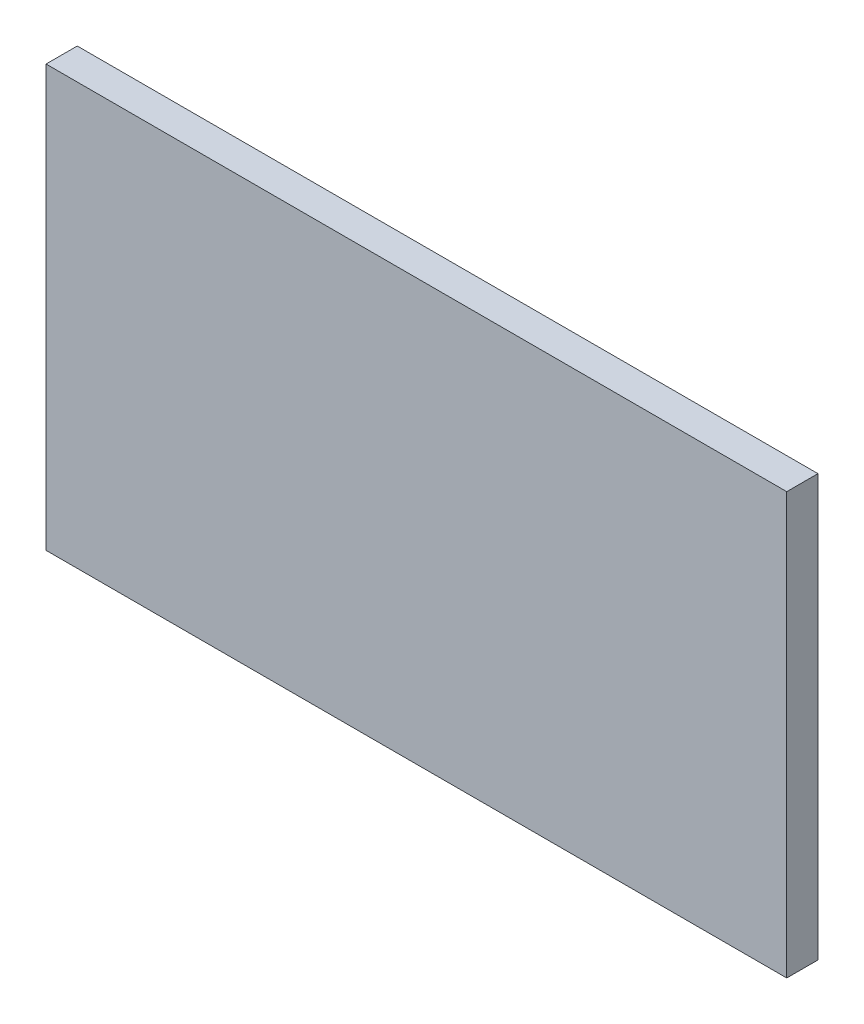
ISO-10303-21;
HEADER;
FILE_DESCRIPTION(('STEP AP214'),'2;1');
FILE_NAME('part.step','',(''),(''),'','','');
FILE_SCHEMA(('AUTOMOTIVE_DESIGN { 1 0 10303 214 1 1 1 1 }'));
ENDSEC;
DATA;
#1=APPLICATION_CONTEXT('core data for automotive mechanical design processes');
#2=APPLICATION_PROTOCOL_DEFINITION('international standard','automotive_design',2000,#1);
#3=PRODUCT_CONTEXT('',#1,'mechanical');
#4=PRODUCT('Part','Part','',(#3));
#5=PRODUCT_RELATED_PRODUCT_CATEGORY('part','',(#4));
#6=PRODUCT_DEFINITION_FORMATION('','',#4);
#7=PRODUCT_DEFINITION_CONTEXT('part definition',#1,'design');
#8=PRODUCT_DEFINITION('design','',#6,#7);
#9=PRODUCT_DEFINITION_SHAPE('','',#8);
#10=(LENGTH_UNIT() NAMED_UNIT(*) SI_UNIT(.MILLI.,.METRE.));
#11=(NAMED_UNIT(*) PLANE_ANGLE_UNIT() SI_UNIT($,.RADIAN.));
#12=(NAMED_UNIT(*) SI_UNIT($,.STERADIAN.) SOLID_ANGLE_UNIT());
#13=UNCERTAINTY_MEASURE_WITH_UNIT(LENGTH_MEASURE(1.E-05),#10,'distance_accuracy_value','');
#14=(GEOMETRIC_REPRESENTATION_CONTEXT(3) GLOBAL_UNCERTAINTY_ASSIGNED_CONTEXT((#13)) GLOBAL_UNIT_ASSIGNED_CONTEXT((#10,
#11,#12)) REPRESENTATION_CONTEXT('',''));
#15=CARTESIAN_POINT('',(0.,0.,0.));
#16=DIRECTION('',(0.,0.,1.));
#17=DIRECTION('',(1.,0.,0.));
#18=AXIS2_PLACEMENT_3D('',#15,#16,#17);
#19=CARTESIAN_POINT('',(11.87,6.75,1.));
#20=DIRECTION('',(-1.,0.,0.));
#21=DIRECTION('',(0.,-1.,0.));
#22=AXIS2_PLACEMENT_3D('',#19,#20,#21);
#23=PLANE('',#22);
#24=DIRECTION('',(0.,1.,0.));
#25=VECTOR('',#24,1.);
#26=CARTESIAN_POINT('',(11.87,6.75,0.));
#27=LINE('',#26,#25);
#28=CARTESIAN_POINT('',(11.87,-6.75,0.));
#29=VERTEX_POINT('',#28);
#30=CARTESIAN_POINT('',(11.87,6.75,0.));
#31=VERTEX_POINT('',#30);
#32=EDGE_CURVE('E109',#29,#31,#27,.T.);
#33=ORIENTED_EDGE('',*,*,#32,.T.);
#34=DIRECTION('',(0.,0.,-1.));
#35=VECTOR('',#34,1.);
#36=CARTESIAN_POINT('',(11.87,6.75,1.));
#37=LINE('',#36,#35);
#38=CARTESIAN_POINT('',(11.87,6.75,1.));
#39=VERTEX_POINT('',#38);
#40=EDGE_CURVE('E11',#39,#31,#37,.T.);
#41=ORIENTED_EDGE('',*,*,#40,.F.);
#42=DIRECTION('',(0.,1.,0.));
#43=VECTOR('',#42,1.);
#44=CARTESIAN_POINT('',(11.87,6.75,1.));
#45=LINE('',#44,#43);
#46=CARTESIAN_POINT('',(11.87,-6.75,1.));
#47=VERTEX_POINT('',#46);
#48=EDGE_CURVE('E93',#47,#39,#45,.T.);
#49=ORIENTED_EDGE('',*,*,#48,.F.);
#50=DIRECTION('',(0.,0.,-1.));
#51=VECTOR('',#50,1.);
#52=CARTESIAN_POINT('',(11.87,-6.75,1.));
#53=LINE('',#52,#51);
#54=EDGE_CURVE('E105',#47,#29,#53,.T.);
#55=ORIENTED_EDGE('',*,*,#54,.T.);
#56=EDGE_LOOP('',(#33,#41,#49,#55));
#57=FACE_BOUND('',#56,.T.);
#58=ADVANCED_FACE('F41',(#57),#23,.F.);
#59=CARTESIAN_POINT('',(-11.87,6.75,1.));
#60=DIRECTION('',(0.,-1.,0.));
#61=DIRECTION('',(0.,0.,-1.));
#62=AXIS2_PLACEMENT_3D('',#59,#60,#61);
#63=PLANE('',#62);
#64=DIRECTION('',(-1.,0.,0.));
#65=VECTOR('',#64,1.);
#66=CARTESIAN_POINT('',(-11.87,6.75,0.));
#67=LINE('',#66,#65);
#68=CARTESIAN_POINT('',(-11.87,6.75,0.));
#69=VERTEX_POINT('',#68);
#70=EDGE_CURVE('E98',#31,#69,#67,.T.);
#71=ORIENTED_EDGE('',*,*,#70,.T.);
#72=DIRECTION('',(0.,0.,-1.));
#73=VECTOR('',#72,1.);
#74=CARTESIAN_POINT('',(-11.87,6.75,1.));
#75=LINE('',#74,#73);
#76=CARTESIAN_POINT('',(-11.87,6.75,1.));
#77=VERTEX_POINT('',#76);
#78=EDGE_CURVE('E50',#77,#69,#75,.T.);
#79=ORIENTED_EDGE('',*,*,#78,.F.);
#80=DIRECTION('',(-1.,0.,0.));
#81=VECTOR('',#80,1.);
#82=CARTESIAN_POINT('',(-11.87,6.75,1.));
#83=LINE('',#82,#81);
#84=EDGE_CURVE('E88',#39,#77,#83,.T.);
#85=ORIENTED_EDGE('',*,*,#84,.F.);
#86=ORIENTED_EDGE('',*,*,#40,.T.);
#87=EDGE_LOOP('',(#71,#79,#85,#86));
#88=FACE_BOUND('',#87,.T.);
#89=ADVANCED_FACE('F97',(#88),#63,.F.);
#90=CARTESIAN_POINT('',(-11.87,6.75,1.));
#91=DIRECTION('',(1.,0.,0.));
#92=DIRECTION('',(0.,1.,0.));
#93=AXIS2_PLACEMENT_3D('',#90,#91,#92);
#94=PLANE('',#93);
#95=DIRECTION('',(0.,-1.,0.));
#96=VECTOR('',#95,1.);
#97=CARTESIAN_POINT('',(-11.87,6.75,0.));
#98=LINE('',#97,#96);
#99=CARTESIAN_POINT('',(-11.87,-6.75,0.));
#100=VERTEX_POINT('',#99);
#101=EDGE_CURVE('E75',#69,#100,#98,.T.);
#102=ORIENTED_EDGE('',*,*,#101,.T.);
#103=DIRECTION('',(0.,0.,-1.));
#104=VECTOR('',#103,1.);
#105=CARTESIAN_POINT('',(-11.87,-6.75,1.));
#106=LINE('',#105,#104);
#107=CARTESIAN_POINT('',(-11.87,-6.75,1.));
#108=VERTEX_POINT('',#107);
#109=EDGE_CURVE('E100',#108,#100,#106,.T.);
#110=ORIENTED_EDGE('',*,*,#109,.F.);
#111=DIRECTION('',(0.,-1.,0.));
#112=VECTOR('',#111,1.);
#113=CARTESIAN_POINT('',(-11.87,6.75,1.));
#114=LINE('',#113,#112);
#115=EDGE_CURVE('E91',#77,#108,#114,.T.);
#116=ORIENTED_EDGE('',*,*,#115,.F.);
#117=ORIENTED_EDGE('',*,*,#78,.T.);
#118=EDGE_LOOP('',(#102,#110,#116,#117));
#119=FACE_BOUND('',#118,.T.);
#120=ADVANCED_FACE('F101',(#119),#94,.F.);
#121=CARTESIAN_POINT('',(-11.87,-6.75,1.));
#122=DIRECTION('',(0.,1.,0.));
#123=DIRECTION('',(0.,0.,1.));
#124=AXIS2_PLACEMENT_3D('',#121,#122,#123);
#125=PLANE('',#124);
#126=DIRECTION('',(1.,0.,0.));
#127=VECTOR('',#126,1.);
#128=CARTESIAN_POINT('',(-11.87,-6.75,0.));
#129=LINE('',#128,#127);
#130=EDGE_CURVE('E81',#100,#29,#129,.T.);
#131=ORIENTED_EDGE('',*,*,#130,.T.);
#132=ORIENTED_EDGE('',*,*,#54,.F.);
#133=DIRECTION('',(1.,0.,0.));
#134=VECTOR('',#133,1.);
#135=CARTESIAN_POINT('',(-11.87,-6.75,1.));
#136=LINE('',#135,#134);
#137=EDGE_CURVE('E58',#108,#47,#136,.T.);
#138=ORIENTED_EDGE('',*,*,#137,.F.);
#139=ORIENTED_EDGE('',*,*,#109,.T.);
#140=EDGE_LOOP('',(#131,#132,#138,#139));
#141=FACE_BOUND('',#140,.T.);
#142=ADVANCED_FACE('F122',(#141),#125,.F.);
#143=CARTESIAN_POINT('',(0.,0.,1.));
#144=DIRECTION('',(0.,0.,1.));
#145=DIRECTION('',(1.,0.,0.));
#146=AXIS2_PLACEMENT_3D('',#143,#144,#145);
#147=PLANE('',#146);
#148=ORIENTED_EDGE('',*,*,#48,.T.);
#149=ORIENTED_EDGE('',*,*,#84,.T.);
#150=ORIENTED_EDGE('',*,*,#115,.T.);
#151=ORIENTED_EDGE('',*,*,#137,.T.);
#152=EDGE_LOOP('',(#148,#149,#150,#151));
#153=FACE_BOUND('',#152,.T.);
#154=ADVANCED_FACE('F89',(#153),#147,.T.);
#155=CARTESIAN_POINT('',(0.,0.,0.));
#156=DIRECTION('',(0.,0.,1.));
#157=DIRECTION('',(1.,0.,0.));
#158=AXIS2_PLACEMENT_3D('',#155,#156,#157);
#159=PLANE('',#158);
#160=ORIENTED_EDGE('',*,*,#32,.F.);
#161=ORIENTED_EDGE('',*,*,#130,.F.);
#162=ORIENTED_EDGE('',*,*,#101,.F.);
#163=ORIENTED_EDGE('',*,*,#70,.F.);
#164=EDGE_LOOP('',(#160,#161,#162,#163));
#165=FACE_BOUND('',#164,.T.);
#166=ADVANCED_FACE('F125',(#165),#159,.F.);
#167=CLOSED_SHELL('',(#58,#89,#120,#142,#154,#166));
#168=MANIFOLD_SOLID_BREP('B2',#167);
#169=ADVANCED_BREP_SHAPE_REPRESENTATION('',(#18,#168),#14);
#170=SHAPE_DEFINITION_REPRESENTATION(#9,#169);
ENDSEC;
END-ISO-10303-21;
